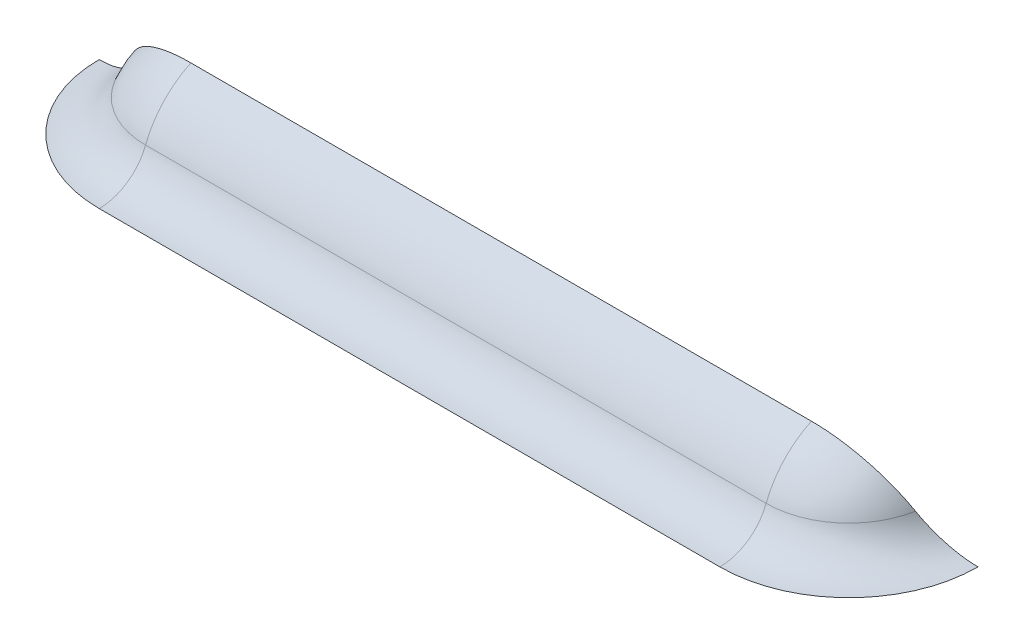
ISO-10303-21;
HEADER;
FILE_DESCRIPTION(('STEP AP214'),'2;1');
FILE_NAME('part.step','',(''),(''),'','','');
FILE_SCHEMA(('AUTOMOTIVE_DESIGN { 1 0 10303 214 1 1 1 1 }'));
ENDSEC;
DATA;
#1=APPLICATION_CONTEXT('core data for automotive mechanical design processes');
#2=APPLICATION_PROTOCOL_DEFINITION('international standard','automotive_design',2000,#1);
#3=PRODUCT_CONTEXT('',#1,'mechanical');
#4=PRODUCT('Part','Part','',(#3));
#5=PRODUCT_RELATED_PRODUCT_CATEGORY('part','',(#4));
#6=PRODUCT_DEFINITION_FORMATION('','',#4);
#7=PRODUCT_DEFINITION_CONTEXT('part definition',#1,'design');
#8=PRODUCT_DEFINITION('design','',#6,#7);
#9=PRODUCT_DEFINITION_SHAPE('','',#8);
#10=(LENGTH_UNIT() NAMED_UNIT(*) SI_UNIT(.MILLI.,.METRE.));
#11=(NAMED_UNIT(*) PLANE_ANGLE_UNIT() SI_UNIT($,.RADIAN.));
#12=(NAMED_UNIT(*) SI_UNIT($,.STERADIAN.) SOLID_ANGLE_UNIT());
#13=UNCERTAINTY_MEASURE_WITH_UNIT(LENGTH_MEASURE(1.E-05),#10,'distance_accuracy_value','');
#14=(GEOMETRIC_REPRESENTATION_CONTEXT(3) GLOBAL_UNCERTAINTY_ASSIGNED_CONTEXT((#13)) GLOBAL_UNIT_ASSIGNED_CONTEXT((#10,
#11,#12)) REPRESENTATION_CONTEXT('',''));
#15=CARTESIAN_POINT('',(0.,0.,0.));
#16=DIRECTION('',(0.,0.,1.));
#17=DIRECTION('',(1.,0.,0.));
#18=AXIS2_PLACEMENT_3D('',#15,#16,#17);
#19=CARTESIAN_POINT('',(19.05,3.46424361052977,-1.96581196581205));
#20=DIRECTION('',(-1.,0.,0.));
#21=DIRECTION('',(0.,0.,1.));
#22=AXIS2_PLACEMENT_3D('',#19,#20,#21);
#23=CYLINDRICAL_SURFACE('',#22,5.44444444444411);
#24=CARTESIAN_POINT('',(19.05,3.46424361052977,-1.96581196581205));
#25=DIRECTION('',(1.,0.,0.));
#26=DIRECTION('',(0.,0.,-1.));
#27=AXIS2_PLACEMENT_3D('',#24,#25,#26);
#28=CIRCLE('',#27,5.44444444444411);
#29=CARTESIAN_POINT('',(19.05,8.39858600661786,0.335109681442745));
#30=VERTEX_POINT('',#29);
#31=CARTESIAN_POINT('',(19.05,5.41829426993932,3.11588669989997));
#32=VERTEX_POINT('',#31);
#33=EDGE_CURVE('E99',#30,#32,#28,.T.);
#34=ORIENTED_EDGE('',*,*,#33,.F.);
#35=DIRECTION('',(1.,0.,0.));
#36=VECTOR('',#35,1.);
#37=CARTESIAN_POINT('',(-50.8,8.39858600661786,0.335109681442745));
#38=LINE('',#37,#36);
#39=CARTESIAN_POINT('',(-19.05,8.39858600661786,0.335109681442745));
#40=VERTEX_POINT('',#39);
#41=EDGE_CURVE('E132',#40,#30,#38,.T.);
#42=ORIENTED_EDGE('',*,*,#41,.F.);
#43=CARTESIAN_POINT('',(-19.05,3.46424361052977,-1.96581196581205));
#44=DIRECTION('',(1.,0.,0.));
#45=DIRECTION('',(0.,0.,-1.));
#46=AXIS2_PLACEMENT_3D('',#43,#44,#45);
#47=CIRCLE('',#46,5.44444444444411);
#48=CARTESIAN_POINT('',(-19.05,5.41829426993932,3.11588669989997));
#49=VERTEX_POINT('',#48);
#50=EDGE_CURVE('E64',#40,#49,#47,.T.);
#51=ORIENTED_EDGE('',*,*,#50,.T.);
#52=DIRECTION('',(-1.,0.,0.));
#53=VECTOR('',#52,1.);
#54=CARTESIAN_POINT('',(19.05,5.41829426993932,3.11588669989997));
#55=LINE('',#54,#53);
#56=EDGE_CURVE('E50',#49,#32,#55,.F.);
#57=ORIENTED_EDGE('',*,*,#56,.T.);
#58=EDGE_LOOP('',(#34,#42,#51,#57));
#59=FACE_BOUND('',#58,.T.);
#60=ADVANCED_FACE('F36',(#59),#23,.T.);
#61=CARTESIAN_POINT('',(-19.05,3.46424361052977,-1.96581196581205));
#62=DIRECTION('',(0.,1.,0.));
#63=DIRECTION('',(-1.,0.,0.));
#64=AXIS2_PLACEMENT_3D('',#61,#62,#63);
#65=SPHERICAL_SURFACE('',#64,5.44444444444411);
#66=ORIENTED_EDGE('',*,*,#50,.F.);
#67=CARTESIAN_POINT('',(-19.05,3.46424361052976,-1.96581196581203));
#68=DIRECTION('',(0.,-0.422618261740701,0.906307787036649));
#69=DIRECTION('',(0.,-0.906307787036649,-0.422618261740701));
#70=AXIS2_PLACEMENT_3D('',#67,#68,#69);
#71=CIRCLE('',#70,5.44444444444411);
#72=CARTESIAN_POINT('',(-24.0493395887574,5.41829426993932,-1.05462317890652));
#73=VERTEX_POINT('',#72);
#74=EDGE_CURVE('E119',#40,#73,#71,.T.);
#75=ORIENTED_EDGE('',*,*,#74,.T.);
#76=CARTESIAN_POINT('',(-19.05,5.41829426993932,-1.96581196581205));
#77=DIRECTION('',(0.,-1.,0.));
#78=DIRECTION('',(0.,0.,-1.));
#79=AXIS2_PLACEMENT_3D('',#76,#77,#78);
#80=CIRCLE('',#79,5.08169866571202);
#81=EDGE_CURVE('E111',#73,#49,#80,.F.);
#82=ORIENTED_EDGE('',*,*,#81,.T.);
#83=EDGE_LOOP('',(#66,#75,#82));
#84=FACE_BOUND('',#83,.T.);
#85=ADVANCED_FACE('F146',(#84),#65,.T.);
#86=CARTESIAN_POINT('',(19.05,3.46424361052977,-1.96581196581205));
#87=DIRECTION('',(0.,1.,0.));
#88=DIRECTION('',(1.,0.,0.));
#89=AXIS2_PLACEMENT_3D('',#86,#87,#88);
#90=SPHERICAL_SURFACE('',#89,5.44444444444411);
#91=CARTESIAN_POINT('',(19.05,5.41829426993932,-1.96581196581205));
#92=DIRECTION('',(0.,-1.,0.));
#93=DIRECTION('',(0.,0.,-1.));
#94=AXIS2_PLACEMENT_3D('',#91,#92,#93);
#95=CIRCLE('',#94,5.08169866571202);
#96=CARTESIAN_POINT('',(24.0493395887574,5.41829426993932,-1.05462317890652));
#97=VERTEX_POINT('',#96);
#98=EDGE_CURVE('E109',#32,#97,#95,.F.);
#99=ORIENTED_EDGE('',*,*,#98,.T.);
#100=CARTESIAN_POINT('',(19.05,3.46424361052976,-1.96581196581203));
#101=DIRECTION('',(0.,-0.422618261740701,0.906307787036649));
#102=DIRECTION('',(0.,-0.906307787036649,-0.422618261740701));
#103=AXIS2_PLACEMENT_3D('',#100,#101,#102);
#104=CIRCLE('',#103,5.44444444444411);
#105=EDGE_CURVE('E57',#97,#30,#104,.T.);
#106=ORIENTED_EDGE('',*,*,#105,.T.);
#107=ORIENTED_EDGE('',*,*,#33,.T.);
#108=EDGE_LOOP('',(#99,#106,#107));
#109=FACE_BOUND('',#108,.T.);
#110=ADVANCED_FACE('F142',(#109),#90,.T.);
#111=CARTESIAN_POINT('',(-19.05,6.51224361052966,-1.96581196581205));
#112=DIRECTION('',(0.,-1.,0.));
#113=DIRECTION('',(0.,0.,-1.));
#114=AXIS2_PLACEMENT_3D('',#111,#112,#113);
#115=TOROIDAL_SURFACE('',#114,7.92662025342266,3.048);
#116=ORIENTED_EDGE('',*,*,#81,.F.);
#117=CARTESIAN_POINT('',(-24.0492444254064,5.41849426993933,-1.05452991737489));
#118=CARTESIAN_POINT('',(-24.0748945596778,5.36458809881302,-1.0796667777929));
#119=CARTESIAN_POINT('',(-24.1018273490528,5.31118984331819,-1.10456679326226));
#120=CARTESIAN_POINT('',(-24.1582622465594,5.20554626312855,-1.1538292037396));
#121=CARTESIAN_POINT('',(-24.1877633648957,5.15330050392335,-1.17819180136311));
#122=CARTESIAN_POINT('',(-24.2803026336083,4.99819051213685,-1.25052077838951));
#123=CARTESIAN_POINT('',(-24.3472549533753,4.89721089238921,-1.29760834839541));
#124=CARTESIAN_POINT('',(-24.4920090419199,4.70107224104197,-1.38906930357883));
#125=CARTESIAN_POINT('',(-24.5698651424206,4.6059460209863,-1.43342738848213));
#126=CARTESIAN_POINT('',(-24.7361031259001,4.42359806193144,-1.51845763823834));
#127=CARTESIAN_POINT('',(-24.8244836733326,4.33637532245349,-1.55913026962217));
#128=CARTESIAN_POINT('',(-25.0434914308754,4.14339741294392,-1.64911734668122));
#129=CARTESIAN_POINT('',(-25.178272743649,4.04140809206433,-1.6966757480574));
#130=CARTESIAN_POINT('',(-25.3927002227789,3.9047597000643,-1.76039593972158));
#131=CARTESIAN_POINT('',(-25.4661625049482,3.86195728111297,-1.78035503546615));
#132=CARTESIAN_POINT('',(-25.6168578402924,3.78222763071134,-1.81753358203045));
#133=CARTESIAN_POINT('',(-25.6940891307546,3.74529768655612,-1.83475429780526));
#134=CARTESIAN_POINT('',(-25.8524808720395,3.67752377970533,-1.86635778959287));
#135=CARTESIAN_POINT('',(-25.9336673959891,3.64672983922905,-1.88071723986173));
#136=CARTESIAN_POINT('',(-26.0987808847792,3.59202851824229,-1.90622488474905));
#137=CARTESIAN_POINT('',(-26.182706490372,3.56811777815429,-1.91737464596424));
#138=CARTESIAN_POINT('',(-26.3525560148974,3.52752881639264,-1.93630158967026));
#139=CARTESIAN_POINT('',(-26.4384775238012,3.51084230574494,-1.94408263737316));
#140=CARTESIAN_POINT('',(-26.6116323615726,3.4849111738083,-1.95617452277985));
#141=CARTESIAN_POINT('',(-26.6988646623081,3.47566100141249,-1.96048794900726));
#142=CARTESIAN_POINT('',(-26.8180708075716,3.46820378133429,-1.96396530783828));
#143=CARTESIAN_POINT('',(-26.8498249205366,3.46671600578576,-1.96465906897017));
#144=CARTESIAN_POINT('',(-26.9133246495454,3.4647357268033,-1.96558248822498));
#145=CARTESIAN_POINT('',(-26.9450702107248,3.46424177836127,-1.96581282016623));
#146=CARTESIAN_POINT('',(-26.9768202534227,3.46424361709134,-1.96581196275232));
#147=B_SPLINE_CURVE_WITH_KNOTS('',3,(#117,#118,#119,#120,#121,#122,#123,#124,#125,#126,#127,
#128,#129,#130,#131,#132,#133,#134,#135,#136,#137,#138,#139,#140,#141,#142,#143,#144,#145,#146),
.UNSPECIFIED.,.F.,.F.,(4,2,2,2,2,2,2,2,2,2,2,2,2,2,4),(0.,0.194291674302114,0.388508800209373,
0.777866480862296,1.16923827669689,1.56056046049221,2.08477781604344,2.34651750060474,
2.60813592485097,2.87180693707125,3.13534903673363,3.39858794549082,3.66163016769526,
3.7570053253637,3.85224170863286),.UNSPECIFIED.);
#148=CARTESIAN_POINT('',(-26.9766202534227,3.46424361052966,-1.96581196581208));
#149=VERTEX_POINT('',#148);
#150=EDGE_CURVE('E129',#73,#149,#147,.T.);
#151=ORIENTED_EDGE('',*,*,#150,.T.);
#152=CARTESIAN_POINT('',(-19.05,3.46424361052966,-1.96581196581205));
#153=DIRECTION('',(0.,-1.,0.));
#154=DIRECTION('',(0.,0.,-1.));
#155=AXIS2_PLACEMENT_3D('',#152,#153,#154);
#156=CIRCLE('',#155,7.92662025342266);
#157=CARTESIAN_POINT('',(-19.05,3.46424361052965,5.9608082876106));
#158=VERTEX_POINT('',#157);
#159=EDGE_CURVE('E96',#158,#149,#156,.T.);
#160=ORIENTED_EDGE('',*,*,#159,.F.);
#161=CARTESIAN_POINT('',(-19.05,6.51224361052966,5.9608082876106));
#162=DIRECTION('',(-1.,0.,0.));
#163=DIRECTION('',(0.,0.,1.));
#164=AXIS2_PLACEMENT_3D('',#161,#162,#163);
#165=CIRCLE('',#164,3.048);
#166=EDGE_CURVE('E118',#49,#158,#165,.T.);
#167=ORIENTED_EDGE('',*,*,#166,.F.);
#168=EDGE_LOOP('',(#116,#151,#160,#167));
#169=FACE_BOUND('',#168,.T.);
#170=ADVANCED_FACE('F38',(#169),#115,.F.);
#171=CARTESIAN_POINT('',(19.05,6.51224361052966,5.9608082876106));
#172=DIRECTION('',(-1.,0.,0.));
#173=DIRECTION('',(0.,0.,1.));
#174=AXIS2_PLACEMENT_3D('',#171,#172,#173);
#175=CYLINDRICAL_SURFACE('',#174,3.048);
#176=ORIENTED_EDGE('',*,*,#166,.T.);
#177=DIRECTION('',(1.,0.,0.));
#178=VECTOR('',#177,1.);
#179=CARTESIAN_POINT('',(-19.05,3.46424361052965,5.9608082876106));
#180=LINE('',#179,#178);
#181=CARTESIAN_POINT('',(19.05,3.46424361052965,5.9608082876106));
#182=VERTEX_POINT('',#181);
#183=EDGE_CURVE('E98',#182,#158,#180,.F.);
#184=ORIENTED_EDGE('',*,*,#183,.F.);
#185=CARTESIAN_POINT('',(19.05,6.51224361052966,5.9608082876106));
#186=DIRECTION('',(-1.,0.,0.));
#187=DIRECTION('',(0.,-1.,0.));
#188=AXIS2_PLACEMENT_3D('',#185,#186,#187);
#189=CIRCLE('',#188,3.048);
#190=EDGE_CURVE('E107',#32,#182,#189,.T.);
#191=ORIENTED_EDGE('',*,*,#190,.F.);
#192=ORIENTED_EDGE('',*,*,#56,.F.);
#193=EDGE_LOOP('',(#176,#184,#191,#192));
#194=FACE_BOUND('',#193,.T.);
#195=ADVANCED_FACE('F154',(#194),#175,.F.);
#196=CARTESIAN_POINT('',(19.05,6.51224361052966,-1.96581196581205));
#197=DIRECTION('',(0.,-1.,0.));
#198=DIRECTION('',(0.,0.,-1.));
#199=AXIS2_PLACEMENT_3D('',#196,#197,#198);
#200=TOROIDAL_SURFACE('',#199,7.92662025342266,3.048);
#201=CARTESIAN_POINT('',(19.05,3.46424361052966,-1.96581196581205));
#202=DIRECTION('',(0.,-1.,0.));
#203=DIRECTION('',(0.,0.,-1.));
#204=AXIS2_PLACEMENT_3D('',#201,#202,#203);
#205=CIRCLE('',#204,7.92662025342266);
#206=CARTESIAN_POINT('',(26.9766202534227,3.46424361052966,-1.96581196581208));
#207=VERTEX_POINT('',#206);
#208=EDGE_CURVE('E93',#207,#182,#205,.T.);
#209=ORIENTED_EDGE('',*,*,#208,.F.);
#210=CARTESIAN_POINT('',(26.9768202534227,3.46424361709134,-1.96581196275232));
#211=CARTESIAN_POINT('',(26.8961756432054,3.46422525226184,-1.96582052641295));
#212=CARTESIAN_POINT('',(26.8155375603952,3.46743317314465,-1.96432464833854));
#213=CARTESIAN_POINT('',(26.6548989747722,3.48020298492452,-1.95836998731239));
#214=CARTESIAN_POINT('',(26.5748982942554,3.4897630373376,-1.95391206165981));
#215=CARTESIAN_POINT('',(26.4164492791113,3.5150846613832,-1.94210439445042));
#216=CARTESIAN_POINT('',(26.3379957900924,3.53081968994953,-1.93476703012866));
#217=CARTESIAN_POINT('',(26.1828719914752,3.56828542986133,-1.91729646868934));
#218=CARTESIAN_POINT('',(26.1062017330779,3.5900163131329,-1.90716319140134));
#219=CARTESIAN_POINT('',(25.8797588455359,3.66381613244782,-1.87274977048434));
#220=CARTESIAN_POINT('',(25.7333072424521,3.72453252704728,-1.84443725070704));
#221=CARTESIAN_POINT('',(25.452986824814,3.86622920291242,-1.77836300561603));
#222=CARTESIAN_POINT('',(25.3191243887993,3.94721968114008,-1.74059652538083));
#223=CARTESIAN_POINT('',(25.0590339259463,4.13119643367636,-1.65480675675068));
#224=CARTESIAN_POINT('',(24.9336507999251,4.23515910303106,-1.60632816786834));
#225=CARTESIAN_POINT('',(24.7003829384773,4.45826229222858,-1.50229344218674));
#226=CARTESIAN_POINT('',(24.5925227732302,4.57742371272518,-1.44672755925254));
#227=CARTESIAN_POINT('',(24.4051676599362,4.81408647741919,-1.33636989967559));
#228=CARTESIAN_POINT('',(24.3238810148644,4.93043801331989,-1.282114287447));
#229=CARTESIAN_POINT('',(24.1758612319199,5.16984068566355,-1.17047898795038));
#230=CARTESIAN_POINT('',(24.1090639646457,5.29285915816591,-1.11311453212799));
#231=CARTESIAN_POINT('',(24.0492444254064,5.41849426993933,-1.05452991737489));
#232=B_SPLINE_CURVE_WITH_KNOTS('',3,(#210,#211,#212,#213,#214,#215,#216,#217,#218,#219,#220,
#221,#222,#223,#224,#225,#226,#227,#228,#229,#230,#231),.UNSPECIFIED.,.F.,.F.,(4,2,2,2,2,2,2,2,
2,2,4),(0.,0.241844494272153,0.483619022476796,0.724365472841513,0.965118827125557,
1.44588264077209,1.92688874477043,2.43477974125575,2.94337685317774,3.39834621795361,
3.85125884899178),.UNSPECIFIED.);
#233=EDGE_CURVE('E11',#207,#97,#232,.T.);
#234=ORIENTED_EDGE('',*,*,#233,.T.);
#235=ORIENTED_EDGE('',*,*,#98,.F.);
#236=ORIENTED_EDGE('',*,*,#190,.T.);
#237=EDGE_LOOP('',(#209,#234,#235,#236));
#238=FACE_BOUND('',#237,.T.);
#239=ADVANCED_FACE('F105',(#238),#200,.F.);
#240=CARTESIAN_POINT('',(-50.8,3.46424361052966,-1.96581196581208));
#241=DIRECTION('',(0.,-0.422618261740701,0.906307787036649));
#242=DIRECTION('',(0.,-0.906307787036649,-0.422618261740701));
#243=AXIS2_PLACEMENT_3D('',#240,#241,#242);
#244=PLANE('',#243);
#245=ORIENTED_EDGE('',*,*,#41,.T.);
#246=ORIENTED_EDGE('',*,*,#105,.F.);
#247=ORIENTED_EDGE('',*,*,#233,.F.);
#248=DIRECTION('',(-1.,0.,0.));
#249=VECTOR('',#248,1.);
#250=CARTESIAN_POINT('',(19.05,3.46424361052977,-1.96581196581205));
#251=LINE('',#250,#249);
#252=EDGE_CURVE('E90',#207,#149,#251,.T.);
#253=ORIENTED_EDGE('',*,*,#252,.T.);
#254=ORIENTED_EDGE('',*,*,#150,.F.);
#255=ORIENTED_EDGE('',*,*,#74,.F.);
#256=EDGE_LOOP('',(#245,#246,#247,#253,#254,#255));
#257=FACE_BOUND('',#256,.T.);
#258=ADVANCED_FACE('F101',(#257),#244,.F.);
#259=CARTESIAN_POINT('',(50.8,3.46424361052965,25.4));
#260=DIRECTION('',(0.,1.,0.));
#261=DIRECTION('',(0.,0.,1.));
#262=AXIS2_PLACEMENT_3D('',#259,#260,#261);
#263=PLANE('',#262);
#264=ORIENTED_EDGE('',*,*,#252,.F.);
#265=ORIENTED_EDGE('',*,*,#208,.T.);
#266=ORIENTED_EDGE('',*,*,#183,.T.);
#267=ORIENTED_EDGE('',*,*,#159,.T.);
#268=EDGE_LOOP('',(#264,#265,#266,#267));
#269=FACE_BOUND('',#268,.T.);
#270=ADVANCED_FACE('F91',(#269),#263,.F.);
#271=CLOSED_SHELL('',(#60,#85,#110,#170,#195,#239,#258,#270));
#272=MANIFOLD_SOLID_BREP('B2',#271);
#273=ADVANCED_BREP_SHAPE_REPRESENTATION('',(#18,#272),#14);
#274=SHAPE_DEFINITION_REPRESENTATION(#9,#273);
ENDSEC;
END-ISO-10303-21;
